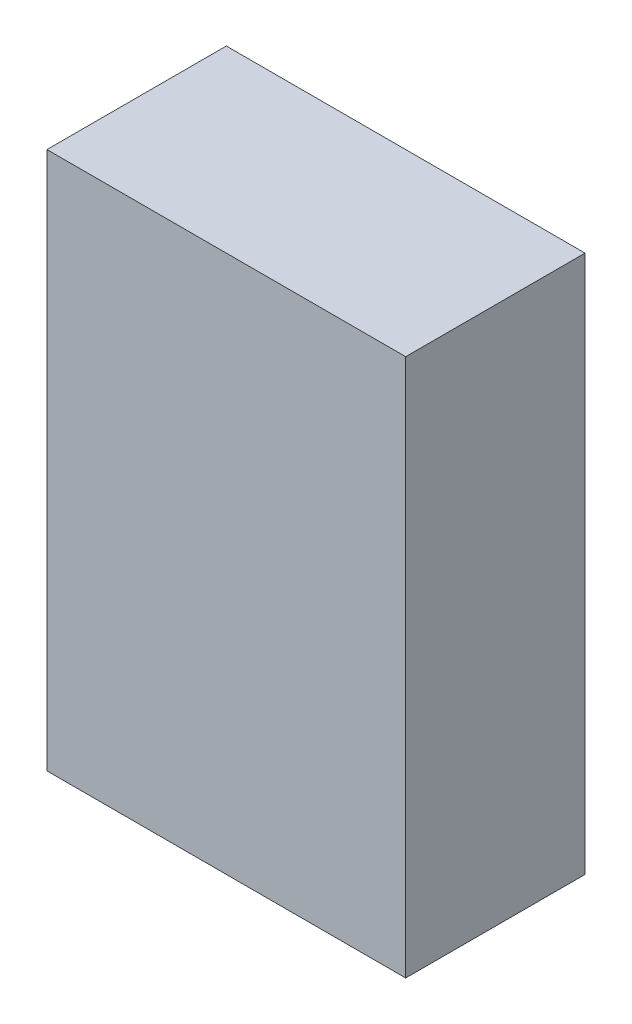
ISO-10303-21;
HEADER;
FILE_DESCRIPTION(('STEP AP214'),'2;1');
FILE_NAME('part.step','',(''),(''),'','','');
FILE_SCHEMA(('AUTOMOTIVE_DESIGN { 1 0 10303 214 1 1 1 1 }'));
ENDSEC;
DATA;
#1=APPLICATION_CONTEXT('core data for automotive mechanical design processes');
#2=APPLICATION_PROTOCOL_DEFINITION('international standard','automotive_design',2000,#1);
#3=PRODUCT_CONTEXT('',#1,'mechanical');
#4=PRODUCT('Part','Part','',(#3));
#5=PRODUCT_RELATED_PRODUCT_CATEGORY('part','',(#4));
#6=PRODUCT_DEFINITION_FORMATION('','',#4);
#7=PRODUCT_DEFINITION_CONTEXT('part definition',#1,'design');
#8=PRODUCT_DEFINITION('design','',#6,#7);
#9=PRODUCT_DEFINITION_SHAPE('','',#8);
#10=(LENGTH_UNIT() NAMED_UNIT(*) SI_UNIT(.MILLI.,.METRE.));
#11=(NAMED_UNIT(*) PLANE_ANGLE_UNIT() SI_UNIT($,.RADIAN.));
#12=(NAMED_UNIT(*) SI_UNIT($,.STERADIAN.) SOLID_ANGLE_UNIT());
#13=UNCERTAINTY_MEASURE_WITH_UNIT(LENGTH_MEASURE(1.E-05),#10,'distance_accuracy_value','');
#14=(GEOMETRIC_REPRESENTATION_CONTEXT(3) GLOBAL_UNCERTAINTY_ASSIGNED_CONTEXT((#13)) GLOBAL_UNIT_ASSIGNED_CONTEXT((#10,
#11,#12)) REPRESENTATION_CONTEXT('',''));
#15=CARTESIAN_POINT('',(0.,0.,0.));
#16=DIRECTION('',(0.,0.,1.));
#17=DIRECTION('',(1.,0.,0.));
#18=AXIS2_PLACEMENT_3D('',#15,#16,#17);
#19=CARTESIAN_POINT('',(2.,3.,2.));
#20=DIRECTION('',(-1.,0.,0.));
#21=DIRECTION('',(0.,0.,1.));
#22=AXIS2_PLACEMENT_3D('',#19,#20,#21);
#23=PLANE('',#22);
#24=DIRECTION('',(0.,1.,0.));
#25=VECTOR('',#24,1.);
#26=CARTESIAN_POINT('',(2.,3.,0.));
#27=LINE('',#26,#25);
#28=CARTESIAN_POINT('',(2.,-3.,0.));
#29=VERTEX_POINT('',#28);
#30=CARTESIAN_POINT('',(2.,3.,0.));
#31=VERTEX_POINT('',#30);
#32=EDGE_CURVE('E98',#29,#31,#27,.T.);
#33=ORIENTED_EDGE('',*,*,#32,.T.);
#34=DIRECTION('',(0.,0.,-1.));
#35=VECTOR('',#34,1.);
#36=CARTESIAN_POINT('',(2.,3.,2.));
#37=LINE('',#36,#35);
#38=CARTESIAN_POINT('',(2.,3.,2.));
#39=VERTEX_POINT('',#38);
#40=EDGE_CURVE('E11',#39,#31,#37,.T.);
#41=ORIENTED_EDGE('',*,*,#40,.F.);
#42=DIRECTION('',(0.,1.,0.));
#43=VECTOR('',#42,1.);
#44=CARTESIAN_POINT('',(2.,3.,2.));
#45=LINE('',#44,#43);
#46=CARTESIAN_POINT('',(2.,-3.,2.));
#47=VERTEX_POINT('',#46);
#48=EDGE_CURVE('E86',#47,#39,#45,.T.);
#49=ORIENTED_EDGE('',*,*,#48,.F.);
#50=DIRECTION('',(0.,0.,-1.));
#51=VECTOR('',#50,1.);
#52=CARTESIAN_POINT('',(2.,-3.,2.));
#53=LINE('',#52,#51);
#54=EDGE_CURVE('E94',#47,#29,#53,.T.);
#55=ORIENTED_EDGE('',*,*,#54,.T.);
#56=EDGE_LOOP('',(#33,#41,#49,#55));
#57=FACE_BOUND('',#56,.T.);
#58=ADVANCED_FACE('F35',(#57),#23,.F.);
#59=CARTESIAN_POINT('',(-2.,3.,2.));
#60=DIRECTION('',(0.,-1.,0.));
#61=DIRECTION('',(0.,0.,-1.));
#62=AXIS2_PLACEMENT_3D('',#59,#60,#61);
#63=PLANE('',#62);
#64=DIRECTION('',(-1.,0.,0.));
#65=VECTOR('',#64,1.);
#66=CARTESIAN_POINT('',(-2.,3.,0.));
#67=LINE('',#66,#65);
#68=CARTESIAN_POINT('',(-2.,3.,0.));
#69=VERTEX_POINT('',#68);
#70=EDGE_CURVE('E90',#31,#69,#67,.T.);
#71=ORIENTED_EDGE('',*,*,#70,.T.);
#72=DIRECTION('',(0.,0.,-1.));
#73=VECTOR('',#72,1.);
#74=CARTESIAN_POINT('',(-2.,3.,2.));
#75=LINE('',#74,#73);
#76=CARTESIAN_POINT('',(-2.,3.,2.));
#77=VERTEX_POINT('',#76);
#78=EDGE_CURVE('E43',#77,#69,#75,.T.);
#79=ORIENTED_EDGE('',*,*,#78,.F.);
#80=DIRECTION('',(-1.,0.,0.));
#81=VECTOR('',#80,1.);
#82=CARTESIAN_POINT('',(-2.,3.,2.));
#83=LINE('',#82,#81);
#84=EDGE_CURVE('E81',#39,#77,#83,.T.);
#85=ORIENTED_EDGE('',*,*,#84,.F.);
#86=ORIENTED_EDGE('',*,*,#40,.T.);
#87=EDGE_LOOP('',(#71,#79,#85,#86));
#88=FACE_BOUND('',#87,.T.);
#89=ADVANCED_FACE('F89',(#88),#63,.F.);
#90=CARTESIAN_POINT('',(-2.,3.,2.));
#91=DIRECTION('',(1.,0.,0.));
#92=DIRECTION('',(0.,0.,-1.));
#93=AXIS2_PLACEMENT_3D('',#90,#91,#92);
#94=PLANE('',#93);
#95=DIRECTION('',(0.,-1.,0.));
#96=VECTOR('',#95,1.);
#97=CARTESIAN_POINT('',(-2.,3.,0.));
#98=LINE('',#97,#96);
#99=CARTESIAN_POINT('',(-2.,-3.,0.));
#100=VERTEX_POINT('',#99);
#101=EDGE_CURVE('E68',#69,#100,#98,.T.);
#102=ORIENTED_EDGE('',*,*,#101,.T.);
#103=DIRECTION('',(0.,0.,-1.));
#104=VECTOR('',#103,1.);
#105=CARTESIAN_POINT('',(-2.,-3.,2.));
#106=LINE('',#105,#104);
#107=CARTESIAN_POINT('',(-2.,-3.,2.));
#108=VERTEX_POINT('',#107);
#109=EDGE_CURVE('E91',#108,#100,#106,.T.);
#110=ORIENTED_EDGE('',*,*,#109,.F.);
#111=DIRECTION('',(0.,-1.,0.));
#112=VECTOR('',#111,1.);
#113=CARTESIAN_POINT('',(-2.,3.,2.));
#114=LINE('',#113,#112);
#115=EDGE_CURVE('E84',#77,#108,#114,.T.);
#116=ORIENTED_EDGE('',*,*,#115,.F.);
#117=ORIENTED_EDGE('',*,*,#78,.T.);
#118=EDGE_LOOP('',(#102,#110,#116,#117));
#119=FACE_BOUND('',#118,.T.);
#120=ADVANCED_FACE('F92',(#119),#94,.F.);
#121=CARTESIAN_POINT('',(-2.,-3.,2.));
#122=DIRECTION('',(0.,1.,0.));
#123=DIRECTION('',(0.,0.,1.));
#124=AXIS2_PLACEMENT_3D('',#121,#122,#123);
#125=PLANE('',#124);
#126=DIRECTION('',(1.,0.,0.));
#127=VECTOR('',#126,1.);
#128=CARTESIAN_POINT('',(-2.,-3.,0.));
#129=LINE('',#128,#127);
#130=EDGE_CURVE('E74',#100,#29,#129,.T.);
#131=ORIENTED_EDGE('',*,*,#130,.T.);
#132=ORIENTED_EDGE('',*,*,#54,.F.);
#133=DIRECTION('',(1.,0.,0.));
#134=VECTOR('',#133,1.);
#135=CARTESIAN_POINT('',(-2.,-3.,2.));
#136=LINE('',#135,#134);
#137=EDGE_CURVE('E51',#108,#47,#136,.T.);
#138=ORIENTED_EDGE('',*,*,#137,.F.);
#139=ORIENTED_EDGE('',*,*,#109,.T.);
#140=EDGE_LOOP('',(#131,#132,#138,#139));
#141=FACE_BOUND('',#140,.T.);
#142=ADVANCED_FACE('F105',(#141),#125,.F.);
#143=CARTESIAN_POINT('',(0.,0.,2.));
#144=DIRECTION('',(0.,0.,1.));
#145=DIRECTION('',(1.,0.,0.));
#146=AXIS2_PLACEMENT_3D('',#143,#144,#145);
#147=PLANE('',#146);
#148=ORIENTED_EDGE('',*,*,#48,.T.);
#149=ORIENTED_EDGE('',*,*,#84,.T.);
#150=ORIENTED_EDGE('',*,*,#115,.T.);
#151=ORIENTED_EDGE('',*,*,#137,.T.);
#152=EDGE_LOOP('',(#148,#149,#150,#151));
#153=FACE_BOUND('',#152,.T.);
#154=ADVANCED_FACE('F82',(#153),#147,.T.);
#155=CARTESIAN_POINT('',(0.,0.,0.));
#156=DIRECTION('',(0.,0.,1.));
#157=DIRECTION('',(1.,0.,0.));
#158=AXIS2_PLACEMENT_3D('',#155,#156,#157);
#159=PLANE('',#158);
#160=ORIENTED_EDGE('',*,*,#32,.F.);
#161=ORIENTED_EDGE('',*,*,#130,.F.);
#162=ORIENTED_EDGE('',*,*,#101,.F.);
#163=ORIENTED_EDGE('',*,*,#70,.F.);
#164=EDGE_LOOP('',(#160,#161,#162,#163));
#165=FACE_BOUND('',#164,.T.);
#166=ADVANCED_FACE('F108',(#165),#159,.F.);
#167=CLOSED_SHELL('',(#58,#89,#120,#142,#154,#166));
#168=MANIFOLD_SOLID_BREP('B2',#167);
#169=ADVANCED_BREP_SHAPE_REPRESENTATION('',(#18,#168),#14);
#170=SHAPE_DEFINITION_REPRESENTATION(#9,#169);
ENDSEC;
END-ISO-10303-21;
